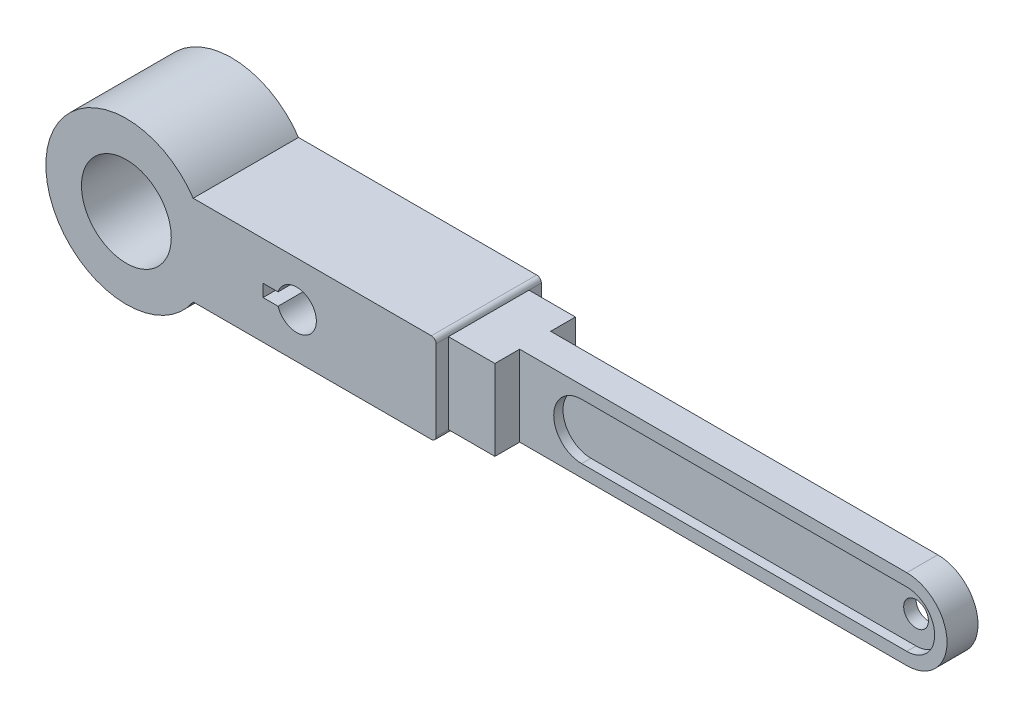
ISO-10303-21;
HEADER;
FILE_DESCRIPTION(('STEP AP214'),'2;1');
FILE_NAME('part.step','',(''),(''),'','','');
FILE_SCHEMA(('AUTOMOTIVE_DESIGN { 1 0 10303 214 1 1 1 1 }'));
ENDSEC;
DATA;
#1=APPLICATION_CONTEXT('core data for automotive mechanical design processes');
#2=APPLICATION_PROTOCOL_DEFINITION('international standard','automotive_design',2000,#1);
#3=PRODUCT_CONTEXT('',#1,'mechanical');
#4=PRODUCT('Part','Part','',(#3));
#5=PRODUCT_RELATED_PRODUCT_CATEGORY('part','',(#4));
#6=PRODUCT_DEFINITION_FORMATION('','',#4);
#7=PRODUCT_DEFINITION_CONTEXT('part definition',#1,'design');
#8=PRODUCT_DEFINITION('design','',#6,#7);
#9=PRODUCT_DEFINITION_SHAPE('','',#8);
#10=(LENGTH_UNIT() NAMED_UNIT(*) SI_UNIT(.MILLI.,.METRE.));
#11=(NAMED_UNIT(*) PLANE_ANGLE_UNIT() SI_UNIT($,.RADIAN.));
#12=(NAMED_UNIT(*) SI_UNIT($,.STERADIAN.) SOLID_ANGLE_UNIT());
#13=UNCERTAINTY_MEASURE_WITH_UNIT(LENGTH_MEASURE(1.E-05),#10,'distance_accuracy_value','');
#14=(GEOMETRIC_REPRESENTATION_CONTEXT(3) GLOBAL_UNCERTAINTY_ASSIGNED_CONTEXT((#13)) GLOBAL_UNIT_ASSIGNED_CONTEXT((#10,
#11,#12)) REPRESENTATION_CONTEXT('',''));
#15=CARTESIAN_POINT('',(0.,0.,0.));
#16=DIRECTION('',(0.,0.,1.));
#17=DIRECTION('',(1.,0.,0.));
#18=AXIS2_PLACEMENT_3D('',#15,#16,#17);
#19=CARTESIAN_POINT('',(18.6199037557532,0.,5.));
#20=DIRECTION('',(0.,0.,-1.));
#21=DIRECTION('',(-1.,0.,0.));
#22=AXIS2_PLACEMENT_3D('',#19,#20,#21);
#23=CYLINDRICAL_SURFACE('',#22,9.);
#24=DIRECTION('',(0.,0.,-1.));
#25=VECTOR('',#24,1.);
#26=CARTESIAN_POINT('',(18.6199037557532,8.99999999999999,5.));
#27=LINE('',#26,#25);
#28=CARTESIAN_POINT('',(18.6199037557532,8.99999999999999,-2.));
#29=VERTEX_POINT('',#28);
#30=CARTESIAN_POINT('',(18.6199037557532,8.99999999999999,-5.));
#31=VERTEX_POINT('',#30);
#32=EDGE_CURVE('E239',#29,#31,#27,.T.);
#33=ORIENTED_EDGE('',*,*,#32,.F.);
#34=CARTESIAN_POINT('',(18.6199037557532,0.,-2.));
#35=DIRECTION('',(0.,0.,1.));
#36=DIRECTION('',(1.,0.,0.));
#37=AXIS2_PLACEMENT_3D('',#34,#35,#36);
#38=CIRCLE('',#37,9.);
#39=CARTESIAN_POINT('',(18.6199037557532,-9.00000000000001,-2.));
#40=VERTEX_POINT('',#39);
#41=EDGE_CURVE('E497',#29,#40,#38,.T.);
#42=ORIENTED_EDGE('',*,*,#41,.T.);
#43=DIRECTION('',(0.,0.,-1.));
#44=VECTOR('',#43,1.);
#45=CARTESIAN_POINT('',(18.6199037557532,-9.00000000000001,5.));
#46=LINE('',#45,#44);
#47=CARTESIAN_POINT('',(18.6199037557532,-9.00000000000001,-5.));
#48=VERTEX_POINT('',#47);
#49=EDGE_CURVE('E458',#40,#48,#46,.T.);
#50=ORIENTED_EDGE('',*,*,#49,.T.);
#51=CARTESIAN_POINT('',(18.6199037557532,0.,-5.));
#52=DIRECTION('',(0.,0.,1.));
#53=DIRECTION('',(1.,0.,0.));
#54=AXIS2_PLACEMENT_3D('',#51,#52,#53);
#55=CIRCLE('',#54,9.);
#56=EDGE_CURVE('E475',#31,#48,#55,.T.);
#57=ORIENTED_EDGE('',*,*,#56,.F.);
#58=EDGE_LOOP('',(#33,#42,#50,#57));
#59=FACE_BOUND('',#58,.T.);
#60=ADVANCED_FACE('F38',(#59),#23,.F.);
#61=CARTESIAN_POINT('',(0.,8.99999999999999,5.));
#62=DIRECTION('',(0.,-1.,0.));
#63=DIRECTION('',(1.,0.,0.));
#64=AXIS2_PLACEMENT_3D('',#61,#62,#63);
#65=PLANE('',#64);
#66=DIRECTION('',(0.,0.,-1.));
#67=VECTOR('',#66,1.);
#68=CARTESIAN_POINT('',(123.619903755753,9.,5.));
#69=LINE('',#68,#67);
#70=CARTESIAN_POINT('',(123.619903755753,9.,-2.));
#71=VERTEX_POINT('',#70);
#72=CARTESIAN_POINT('',(123.619903755753,9.,-5.));
#73=VERTEX_POINT('',#72);
#74=EDGE_CURVE('E461',#71,#73,#69,.T.);
#75=ORIENTED_EDGE('',*,*,#74,.F.);
#76=DIRECTION('',(-1.,0.,0.));
#77=VECTOR('',#76,1.);
#78=CARTESIAN_POINT('',(0.,8.99999999999999,-2.));
#79=LINE('',#78,#77);
#80=EDGE_CURVE('E55',#71,#29,#79,.T.);
#81=ORIENTED_EDGE('',*,*,#80,.T.);
#82=ORIENTED_EDGE('',*,*,#32,.T.);
#83=DIRECTION('',(-1.,0.,0.));
#84=VECTOR('',#83,1.);
#85=CARTESIAN_POINT('',(0.,8.99999999999999,-5.));
#86=LINE('',#85,#84);
#87=EDGE_CURVE('E478',#73,#31,#86,.T.);
#88=ORIENTED_EDGE('',*,*,#87,.F.);
#89=EDGE_LOOP('',(#75,#81,#82,#88));
#90=FACE_BOUND('',#89,.T.);
#91=ADVANCED_FACE('F523',(#90),#65,.T.);
#92=CARTESIAN_POINT('',(123.619903755753,0.,5.));
#93=DIRECTION('',(0.,0.,-1.));
#94=DIRECTION('',(-1.,0.,0.));
#95=AXIS2_PLACEMENT_3D('',#92,#93,#94);
#96=CYLINDRICAL_SURFACE('',#95,9.);
#97=DIRECTION('',(0.,0.,-1.));
#98=VECTOR('',#97,1.);
#99=CARTESIAN_POINT('',(123.619903755753,-9.,5.));
#100=LINE('',#99,#98);
#101=CARTESIAN_POINT('',(123.619903755753,-9.,-2.));
#102=VERTEX_POINT('',#101);
#103=CARTESIAN_POINT('',(123.619903755753,-9.,-5.));
#104=VERTEX_POINT('',#103);
#105=EDGE_CURVE('E457',#102,#104,#100,.T.);
#106=ORIENTED_EDGE('',*,*,#105,.F.);
#107=CARTESIAN_POINT('',(123.619903755753,0.,-2.));
#108=DIRECTION('',(0.,0.,1.));
#109=DIRECTION('',(1.,0.,0.));
#110=AXIS2_PLACEMENT_3D('',#107,#108,#109);
#111=CIRCLE('',#110,9.);
#112=EDGE_CURVE('E63',#102,#71,#111,.T.);
#113=ORIENTED_EDGE('',*,*,#112,.T.);
#114=ORIENTED_EDGE('',*,*,#74,.T.);
#115=CARTESIAN_POINT('',(123.619903755753,0.,-5.));
#116=DIRECTION('',(0.,0.,1.));
#117=DIRECTION('',(1.,0.,0.));
#118=AXIS2_PLACEMENT_3D('',#115,#116,#117);
#119=CIRCLE('',#118,9.);
#120=EDGE_CURVE('E448',#104,#73,#119,.T.);
#121=ORIENTED_EDGE('',*,*,#120,.F.);
#122=EDGE_LOOP('',(#106,#113,#114,#121));
#123=FACE_BOUND('',#122,.T.);
#124=ADVANCED_FACE('F476',(#123),#96,.F.);
#125=CARTESIAN_POINT('',(0.,-9.00000000000001,5.));
#126=DIRECTION('',(0.,-1.,0.));
#127=DIRECTION('',(1.,0.,0.));
#128=AXIS2_PLACEMENT_3D('',#125,#126,#127);
#129=PLANE('',#128);
#130=DIRECTION('',(-1.,0.,0.));
#131=VECTOR('',#130,1.);
#132=CARTESIAN_POINT('',(0.,-9.00000000000001,-2.));
#133=LINE('',#132,#131);
#134=EDGE_CURVE('E469',#102,#40,#133,.T.);
#135=ORIENTED_EDGE('',*,*,#134,.F.);
#136=ORIENTED_EDGE('',*,*,#105,.T.);
#137=DIRECTION('',(-1.,0.,0.));
#138=VECTOR('',#137,1.);
#139=CARTESIAN_POINT('',(0.,-9.00000000000001,-5.));
#140=LINE('',#139,#138);
#141=EDGE_CURVE('E443',#104,#48,#140,.T.);
#142=ORIENTED_EDGE('',*,*,#141,.T.);
#143=ORIENTED_EDGE('',*,*,#49,.F.);
#144=EDGE_LOOP('',(#135,#136,#142,#143));
#145=FACE_BOUND('',#144,.T.);
#146=ADVANCED_FACE('F466',(#145),#129,.F.);
#147=CARTESIAN_POINT('',(-1.37743143338943,0.,13.));
#148=DIRECTION('',(1.,0.,0.));
#149=DIRECTION('',(0.,0.,-1.));
#150=AXIS2_PLACEMENT_3D('',#147,#148,#149);
#151=PLANE('',#150);
#152=DIRECTION('',(0.,0.,-1.));
#153=VECTOR('',#152,1.);
#154=CARTESIAN_POINT('',(-1.37743143338943,13.000001379028,13.));
#155=LINE('',#154,#153);
#156=CARTESIAN_POINT('',(-1.37743143338943,13.000001379028,-4.99999999999999));
#157=VERTEX_POINT('',#156);
#158=CARTESIAN_POINT('',(-1.37743143338943,13.000001379028,-13.));
#159=VERTEX_POINT('',#158);
#160=EDGE_CURVE('E279',#157,#159,#155,.T.);
#161=ORIENTED_EDGE('',*,*,#160,.F.);
#162=DIRECTION('',(0.,-1.,0.));
#163=VECTOR('',#162,1.);
#164=CARTESIAN_POINT('',(-1.37743143338943,0.,-5.));
#165=LINE('',#164,#163);
#166=CARTESIAN_POINT('',(-1.37743143338943,-13.,-4.99999999999999));
#167=VERTEX_POINT('',#166);
#168=EDGE_CURVE('E428',#157,#167,#165,.T.);
#169=ORIENTED_EDGE('',*,*,#168,.T.);
#170=DIRECTION('',(0.,0.,-1.));
#171=VECTOR('',#170,1.);
#172=CARTESIAN_POINT('',(-1.37743143338943,-13.,13.));
#173=LINE('',#172,#171);
#174=CARTESIAN_POINT('',(-1.37743143338943,-13.,-13.));
#175=VERTEX_POINT('',#174);
#176=EDGE_CURVE('E259',#167,#175,#173,.T.);
#177=ORIENTED_EDGE('',*,*,#176,.T.);
#178=DIRECTION('',(0.,-1.,0.));
#179=VECTOR('',#178,1.);
#180=CARTESIAN_POINT('',(-1.37743143338943,0.,-13.));
#181=LINE('',#180,#179);
#182=EDGE_CURVE('E260',#159,#175,#181,.T.);
#183=ORIENTED_EDGE('',*,*,#182,.F.);
#184=EDGE_LOOP('',(#161,#169,#177,#183));
#185=FACE_BOUND('',#184,.T.);
#186=ADVANCED_FACE('F426',(#185),#151,.T.);
#187=CARTESIAN_POINT('',(-16.3774314333894,0.,17.));
#188=DIRECTION('',(1.,0.,0.));
#189=DIRECTION('',(0.,0.,-1.));
#190=AXIS2_PLACEMENT_3D('',#187,#188,#189);
#191=PLANE('',#190);
#192=DIRECTION('',(0.,0.,-1.));
#193=VECTOR('',#192,1.);
#194=CARTESIAN_POINT('',(-16.3774314333894,13.,17.));
#195=LINE('',#194,#193);
#196=CARTESIAN_POINT('',(-16.3774314333894,13.,-13.));
#197=VERTEX_POINT('',#196);
#198=CARTESIAN_POINT('',(-16.3774314333894,13.,-17.));
#199=VERTEX_POINT('',#198);
#200=EDGE_CURVE('E359',#197,#199,#195,.T.);
#201=ORIENTED_EDGE('',*,*,#200,.F.);
#202=DIRECTION('',(0.,-1.,0.));
#203=VECTOR('',#202,1.);
#204=CARTESIAN_POINT('',(-16.3774314333894,0.,-13.));
#205=LINE('',#204,#203);
#206=CARTESIAN_POINT('',(-16.3774314333894,-13.,-13.));
#207=VERTEX_POINT('',#206);
#208=EDGE_CURVE('E267',#197,#207,#205,.T.);
#209=ORIENTED_EDGE('',*,*,#208,.T.);
#210=DIRECTION('',(0.,0.,-1.));
#211=VECTOR('',#210,1.);
#212=CARTESIAN_POINT('',(-16.3774314333894,-13.,17.));
#213=LINE('',#212,#211);
#214=CARTESIAN_POINT('',(-16.3774314333894,-13.,-17.));
#215=VERTEX_POINT('',#214);
#216=EDGE_CURVE('E362',#207,#215,#213,.T.);
#217=ORIENTED_EDGE('',*,*,#216,.T.);
#218=DIRECTION('',(0.,-1.,0.));
#219=VECTOR('',#218,1.);
#220=CARTESIAN_POINT('',(-16.3774314333894,0.,-17.));
#221=LINE('',#220,#219);
#222=EDGE_CURVE('E318',#199,#215,#221,.T.);
#223=ORIENTED_EDGE('',*,*,#222,.F.);
#224=EDGE_LOOP('',(#201,#209,#217,#223));
#225=FACE_BOUND('',#224,.T.);
#226=ADVANCED_FACE('F377',(#225),#191,.T.);
#227=CARTESIAN_POINT('',(-61.3774314333894,0.,17.));
#228=DIRECTION('',(0.,0.,-1.));
#229=DIRECTION('',(-1.,0.,0.));
#230=AXIS2_PLACEMENT_3D('',#227,#228,#229);
#231=CYLINDRICAL_SURFACE('',#230,6.35);
#232=CARTESIAN_POINT('',(-61.3774314333894,0.,-17.));
#233=DIRECTION('',(0.,0.,1.));
#234=DIRECTION('',(1.,0.,0.));
#235=AXIS2_PLACEMENT_3D('',#232,#233,#234);
#236=CIRCLE('',#235,6.35);
#237=CARTESIAN_POINT('',(-67.404246512683,-2.,-17.));
#238=VERTEX_POINT('',#237);
#239=CARTESIAN_POINT('',(-67.404246512683,2.,-17.));
#240=VERTEX_POINT('',#239);
#241=EDGE_CURVE('E333',#238,#240,#236,.T.);
#242=ORIENTED_EDGE('',*,*,#241,.F.);
#243=DIRECTION('',(0.,0.,-1.));
#244=VECTOR('',#243,1.);
#245=CARTESIAN_POINT('',(-67.404246512683,-2.,17.));
#246=LINE('',#245,#244);
#247=CARTESIAN_POINT('',(-67.404246512683,-2.,17.));
#248=VERTEX_POINT('',#247);
#249=EDGE_CURVE('E11',#248,#238,#246,.T.);
#250=ORIENTED_EDGE('',*,*,#249,.F.);
#251=CARTESIAN_POINT('',(-61.3774314333894,0.,17.));
#252=DIRECTION('',(0.,0.,1.));
#253=DIRECTION('',(1.,0.,0.));
#254=AXIS2_PLACEMENT_3D('',#251,#252,#253);
#255=CIRCLE('',#254,6.35);
#256=CARTESIAN_POINT('',(-67.404246512683,2.,17.));
#257=VERTEX_POINT('',#256);
#258=EDGE_CURVE('E301',#248,#257,#255,.T.);
#259=ORIENTED_EDGE('',*,*,#258,.T.);
#260=DIRECTION('',(0.,0.,-1.));
#261=VECTOR('',#260,1.);
#262=CARTESIAN_POINT('',(-67.404246512683,2.,17.));
#263=LINE('',#262,#261);
#264=EDGE_CURVE('E347',#257,#240,#263,.T.);
#265=ORIENTED_EDGE('',*,*,#264,.T.);
#266=EDGE_LOOP('',(#242,#250,#259,#265));
#267=FACE_BOUND('',#266,.T.);
#268=ADVANCED_FACE('F566',(#267),#231,.F.);
#269=CARTESIAN_POINT('',(0.,-1.99999999999999,17.));
#270=DIRECTION('',(0.,-1.,0.));
#271=DIRECTION('',(1.,0.,0.));
#272=AXIS2_PLACEMENT_3D('',#269,#270,#271);
#273=PLANE('',#272);
#274=DIRECTION('',(-1.,0.,0.));
#275=VECTOR('',#274,1.);
#276=CARTESIAN_POINT('',(0.,-1.99999999999999,-17.));
#277=LINE('',#276,#275);
#278=CARTESIAN_POINT('',(-72.2433545143328,-2.,-17.));
#279=VERTEX_POINT('',#278);
#280=EDGE_CURVE('E336',#238,#279,#277,.T.);
#281=ORIENTED_EDGE('',*,*,#280,.T.);
#282=DIRECTION('',(0.,0.,-1.));
#283=VECTOR('',#282,1.);
#284=CARTESIAN_POINT('',(-72.2433545143328,-2.,17.));
#285=LINE('',#284,#283);
#286=CARTESIAN_POINT('',(-72.2433545143328,-2.,17.));
#287=VERTEX_POINT('',#286);
#288=EDGE_CURVE('E47',#287,#279,#285,.T.);
#289=ORIENTED_EDGE('',*,*,#288,.F.);
#290=DIRECTION('',(-1.,0.,0.));
#291=VECTOR('',#290,1.);
#292=CARTESIAN_POINT('',(0.,-1.99999999999999,17.));
#293=LINE('',#292,#291);
#294=EDGE_CURVE('E304',#248,#287,#293,.T.);
#295=ORIENTED_EDGE('',*,*,#294,.F.);
#296=ORIENTED_EDGE('',*,*,#249,.T.);
#297=EDGE_LOOP('',(#281,#289,#295,#296));
#298=FACE_BOUND('',#297,.T.);
#299=ADVANCED_FACE('F590',(#298),#273,.F.);
#300=CARTESIAN_POINT('',(-72.2433545143328,0.,17.));
#301=DIRECTION('',(-1.,0.,0.));
#302=DIRECTION('',(0.,0.,1.));
#303=AXIS2_PLACEMENT_3D('',#300,#301,#302);
#304=PLANE('',#303);
#305=DIRECTION('',(0.,1.,0.));
#306=VECTOR('',#305,1.);
#307=CARTESIAN_POINT('',(-72.2433545143328,0.,-17.));
#308=LINE('',#307,#306);
#309=CARTESIAN_POINT('',(-72.2433545143328,2.,-17.));
#310=VERTEX_POINT('',#309);
#311=EDGE_CURVE('E339',#279,#310,#308,.T.);
#312=ORIENTED_EDGE('',*,*,#311,.T.);
#313=DIRECTION('',(0.,0.,-1.));
#314=VECTOR('',#313,1.);
#315=CARTESIAN_POINT('',(-72.2433545143328,2.,17.));
#316=LINE('',#315,#314);
#317=CARTESIAN_POINT('',(-72.2433545143328,2.,17.));
#318=VERTEX_POINT('',#317);
#319=EDGE_CURVE('E349',#318,#310,#316,.T.);
#320=ORIENTED_EDGE('',*,*,#319,.F.);
#321=DIRECTION('',(0.,1.,0.));
#322=VECTOR('',#321,1.);
#323=CARTESIAN_POINT('',(-72.2433545143328,0.,17.));
#324=LINE('',#323,#322);
#325=EDGE_CURVE('E307',#287,#318,#324,.T.);
#326=ORIENTED_EDGE('',*,*,#325,.F.);
#327=ORIENTED_EDGE('',*,*,#288,.T.);
#328=EDGE_LOOP('',(#312,#320,#326,#327));
#329=FACE_BOUND('',#328,.T.);
#330=ADVANCED_FACE('F587',(#329),#304,.F.);
#331=CARTESIAN_POINT('',(-17.8774314333894,-13.,17.));
#332=DIRECTION('',(0.,0.,-1.));
#333=DIRECTION('',(-1.,0.,0.));
#334=AXIS2_PLACEMENT_3D('',#331,#332,#333);
#335=CYLINDRICAL_SURFACE('',#334,1.5);
#336=CARTESIAN_POINT('',(-17.8774314333894,-13.,-17.));
#337=DIRECTION('',(0.,0.,1.));
#338=DIRECTION('',(1.,0.,0.));
#339=AXIS2_PLACEMENT_3D('',#336,#337,#338);
#340=CIRCLE('',#339,1.5);
#341=CARTESIAN_POINT('',(-17.8774314333894,-14.5,-17.));
#342=VERTEX_POINT('',#341);
#343=EDGE_CURVE('E283',#215,#342,#340,.F.);
#344=ORIENTED_EDGE('',*,*,#343,.F.);
#345=ORIENTED_EDGE('',*,*,#216,.F.);
#346=DIRECTION('',(0.,0.,-1.));
#347=VECTOR('',#346,1.);
#348=CARTESIAN_POINT('',(-16.3774314333894,-13.,13.));
#349=LINE('',#348,#347);
#350=CARTESIAN_POINT('',(-16.3774314333894,-13.,13.));
#351=VERTEX_POINT('',#350);
#352=EDGE_CURVE('E274',#351,#207,#349,.T.);
#353=ORIENTED_EDGE('',*,*,#352,.F.);
#354=CARTESIAN_POINT('',(-16.3774314333894,-13.,17.));
#355=VERTEX_POINT('',#354);
#356=EDGE_CURVE('E42',#355,#351,#213,.T.);
#357=ORIENTED_EDGE('',*,*,#356,.F.);
#358=CARTESIAN_POINT('',(-17.8774314333894,-13.,17.));
#359=DIRECTION('',(0.,0.,1.));
#360=DIRECTION('',(1.,0.,0.));
#361=AXIS2_PLACEMENT_3D('',#358,#359,#360);
#362=CIRCLE('',#361,1.5);
#363=CARTESIAN_POINT('',(-17.8774314333894,-14.5,17.));
#364=VERTEX_POINT('',#363);
#365=EDGE_CURVE('E284',#355,#364,#362,.F.);
#366=ORIENTED_EDGE('',*,*,#365,.T.);
#367=DIRECTION('',(0.,0.,-1.));
#368=VECTOR('',#367,1.);
#369=CARTESIAN_POINT('',(-17.8774314333894,-14.5,17.));
#370=LINE('',#369,#368);
#371=EDGE_CURVE('E315',#364,#342,#370,.T.);
#372=ORIENTED_EDGE('',*,*,#371,.T.);
#373=EDGE_LOOP('',(#344,#345,#353,#357,#366,#372));
#374=FACE_BOUND('',#373,.T.);
#375=ADVANCED_FACE('F40',(#374),#335,.T.);
#376=DIRECTION('',(0.,-1.,0.));
#377=VECTOR('',#376,1.);
#378=CARTESIAN_POINT('',(-16.3774314333894,0.,13.));
#379=LINE('',#378,#377);
#380=CARTESIAN_POINT('',(-16.3774314333894,13.,13.));
#381=VERTEX_POINT('',#380);
#382=EDGE_CURVE('E254',#381,#351,#379,.T.);
#383=ORIENTED_EDGE('',*,*,#382,.F.);
#384=CARTESIAN_POINT('',(-16.3774314333894,13.,17.));
#385=VERTEX_POINT('',#384);
#386=EDGE_CURVE('E360',#385,#381,#195,.T.);
#387=ORIENTED_EDGE('',*,*,#386,.F.);
#388=DIRECTION('',(0.,-1.,0.));
#389=VECTOR('',#388,1.);
#390=CARTESIAN_POINT('',(-16.3774314333894,0.,17.));
#391=LINE('',#390,#389);
#392=EDGE_CURVE('E287',#385,#355,#391,.T.);
#393=ORIENTED_EDGE('',*,*,#392,.T.);
#394=ORIENTED_EDGE('',*,*,#356,.T.);
#395=EDGE_LOOP('',(#383,#387,#393,#394));
#396=FACE_BOUND('',#395,.T.);
#397=ADVANCED_FACE('F401',(#396),#191,.T.);
#398=CARTESIAN_POINT('',(-17.8774314333894,13.,17.));
#399=DIRECTION('',(0.,0.,-1.));
#400=DIRECTION('',(-1.,0.,0.));
#401=AXIS2_PLACEMENT_3D('',#398,#399,#400);
#402=CYLINDRICAL_SURFACE('',#401,1.5);
#403=CARTESIAN_POINT('',(-17.8774314333894,13.,-17.));
#404=DIRECTION('',(0.,0.,1.));
#405=DIRECTION('',(1.,0.,0.));
#406=AXIS2_PLACEMENT_3D('',#403,#404,#405);
#407=CIRCLE('',#406,1.5);
#408=CARTESIAN_POINT('',(-17.8774314333894,14.5,-17.));
#409=VERTEX_POINT('',#408);
#410=EDGE_CURVE('E321',#199,#409,#407,.T.);
#411=ORIENTED_EDGE('',*,*,#410,.T.);
#412=DIRECTION('',(0.,0.,-1.));
#413=VECTOR('',#412,1.);
#414=CARTESIAN_POINT('',(-17.8774314333894,14.5,17.));
#415=LINE('',#414,#413);
#416=CARTESIAN_POINT('',(-17.8774314333894,14.5,17.));
#417=VERTEX_POINT('',#416);
#418=EDGE_CURVE('E358',#417,#409,#415,.T.);
#419=ORIENTED_EDGE('',*,*,#418,.F.);
#420=CARTESIAN_POINT('',(-17.8774314333894,13.,17.));
#421=DIRECTION('',(0.,0.,1.));
#422=DIRECTION('',(1.,0.,0.));
#423=AXIS2_PLACEMENT_3D('',#420,#421,#422);
#424=CIRCLE('',#423,1.5);
#425=EDGE_CURVE('E291',#385,#417,#424,.T.);
#426=ORIENTED_EDGE('',*,*,#425,.F.);
#427=ORIENTED_EDGE('',*,*,#386,.T.);
#428=DIRECTION('',(0.,0.,-1.));
#429=VECTOR('',#428,1.);
#430=CARTESIAN_POINT('',(-16.3774314333894,13.,13.));
#431=LINE('',#430,#429);
#432=EDGE_CURVE('E276',#381,#197,#431,.T.);
#433=ORIENTED_EDGE('',*,*,#432,.T.);
#434=ORIENTED_EDGE('',*,*,#200,.T.);
#435=EDGE_LOOP('',(#411,#419,#426,#427,#433,#434));
#436=FACE_BOUND('',#435,.T.);
#437=ADVANCED_FACE('F367',(#436),#402,.T.);
#438=CARTESIAN_POINT('',(0.,14.5,17.));
#439=DIRECTION('',(0.,1.,0.));
#440=DIRECTION('',(0.,0.,1.));
#441=AXIS2_PLACEMENT_3D('',#438,#439,#440);
#442=PLANE('',#441);
#443=DIRECTION('',(1.,0.,0.));
#444=VECTOR('',#443,1.);
#445=CARTESIAN_POINT('',(0.,14.5,-17.));
#446=LINE('',#445,#444);
#447=CARTESIAN_POINT('',(-94.7961895784822,14.5,-17.));
#448=VERTEX_POINT('',#447);
#449=EDGE_CURVE('E324',#448,#409,#446,.T.);
#450=ORIENTED_EDGE('',*,*,#449,.F.);
#451=DIRECTION('',(0.,0.,-1.));
#452=VECTOR('',#451,1.);
#453=CARTESIAN_POINT('',(-94.7961895784822,14.5,17.));
#454=LINE('',#453,#452);
#455=CARTESIAN_POINT('',(-94.7961895784822,14.5,17.));
#456=VERTEX_POINT('',#455);
#457=EDGE_CURVE('E356',#456,#448,#454,.T.);
#458=ORIENTED_EDGE('',*,*,#457,.F.);
#459=DIRECTION('',(1.,0.,0.));
#460=VECTOR('',#459,1.);
#461=CARTESIAN_POINT('',(0.,14.5,17.));
#462=LINE('',#461,#460);
#463=EDGE_CURVE('E293',#456,#417,#462,.T.);
#464=ORIENTED_EDGE('',*,*,#463,.T.);
#465=ORIENTED_EDGE('',*,*,#418,.T.);
#466=EDGE_LOOP('',(#450,#458,#464,#465));
#467=FACE_BOUND('',#466,.T.);
#468=ADVANCED_FACE('F391',(#467),#442,.T.);
#469=CARTESIAN_POINT('',(-116.377431433389,0.,17.));
#470=DIRECTION('',(0.,0.,-1.));
#471=DIRECTION('',(-1.,0.,0.));
#472=AXIS2_PLACEMENT_3D('',#469,#470,#471);
#473=CYLINDRICAL_SURFACE('',#472,26.);
#474=CARTESIAN_POINT('',(-116.377431433389,0.,-17.));
#475=DIRECTION('',(0.,0.,1.));
#476=DIRECTION('',(1.,0.,0.));
#477=AXIS2_PLACEMENT_3D('',#474,#475,#476);
#478=CIRCLE('',#477,26.);
#479=CARTESIAN_POINT('',(-94.7961895784822,-14.5,-17.));
#480=VERTEX_POINT('',#479);
#481=EDGE_CURVE('E327',#448,#480,#478,.T.);
#482=ORIENTED_EDGE('',*,*,#481,.T.);
#483=DIRECTION('',(0.,0.,-1.));
#484=VECTOR('',#483,1.);
#485=CARTESIAN_POINT('',(-94.7961895784822,-14.5,17.));
#486=LINE('',#485,#484);
#487=CARTESIAN_POINT('',(-94.7961895784822,-14.5,17.));
#488=VERTEX_POINT('',#487);
#489=EDGE_CURVE('E354',#488,#480,#486,.T.);
#490=ORIENTED_EDGE('',*,*,#489,.F.);
#491=CARTESIAN_POINT('',(-116.377431433389,0.,17.));
#492=DIRECTION('',(0.,0.,1.));
#493=DIRECTION('',(1.,0.,0.));
#494=AXIS2_PLACEMENT_3D('',#491,#492,#493);
#495=CIRCLE('',#494,26.);
#496=EDGE_CURVE('E296',#456,#488,#495,.T.);
#497=ORIENTED_EDGE('',*,*,#496,.F.);
#498=ORIENTED_EDGE('',*,*,#457,.T.);
#499=EDGE_LOOP('',(#482,#490,#497,#498));
#500=FACE_BOUND('',#499,.T.);
#501=ADVANCED_FACE('F389',(#500),#473,.T.);
#502=CARTESIAN_POINT('',(0.,2.00000000000001,17.));
#503=DIRECTION('',(0.,-1.,0.));
#504=DIRECTION('',(1.,0.,0.));
#505=AXIS2_PLACEMENT_3D('',#502,#503,#504);
#506=PLANE('',#505);
#507=DIRECTION('',(-1.,0.,0.));
#508=VECTOR('',#507,1.);
#509=CARTESIAN_POINT('',(0.,2.00000000000001,-17.));
#510=LINE('',#509,#508);
#511=EDGE_CURVE('E342',#240,#310,#510,.T.);
#512=ORIENTED_EDGE('',*,*,#511,.F.);
#513=ORIENTED_EDGE('',*,*,#264,.F.);
#514=DIRECTION('',(-1.,0.,0.));
#515=VECTOR('',#514,1.);
#516=CARTESIAN_POINT('',(0.,2.00000000000001,17.));
#517=LINE('',#516,#515);
#518=EDGE_CURVE('E309',#257,#318,#517,.T.);
#519=ORIENTED_EDGE('',*,*,#518,.T.);
#520=ORIENTED_EDGE('',*,*,#319,.T.);
#521=EDGE_LOOP('',(#512,#513,#519,#520));
#522=FACE_BOUND('',#521,.T.);
#523=ADVANCED_FACE('F583',(#522),#506,.T.);
#524=CARTESIAN_POINT('',(0.,-14.4999999999997,17.));
#525=DIRECTION('',(0.,-1.,0.));
#526=DIRECTION('',(1.,0.,0.));
#527=AXIS2_PLACEMENT_3D('',#524,#525,#526);
#528=PLANE('',#527);
#529=DIRECTION('',(-1.,0.,0.));
#530=VECTOR('',#529,1.);
#531=CARTESIAN_POINT('',(0.,-14.4999999999997,-17.));
#532=LINE('',#531,#530);
#533=EDGE_CURVE('E330',#342,#480,#532,.T.);
#534=ORIENTED_EDGE('',*,*,#533,.F.);
#535=ORIENTED_EDGE('',*,*,#371,.F.);
#536=DIRECTION('',(-1.,0.,0.));
#537=VECTOR('',#536,1.);
#538=CARTESIAN_POINT('',(0.,-14.4999999999997,17.));
#539=LINE('',#538,#537);
#540=EDGE_CURVE('E298',#364,#488,#539,.T.);
#541=ORIENTED_EDGE('',*,*,#540,.T.);
#542=ORIENTED_EDGE('',*,*,#489,.T.);
#543=EDGE_LOOP('',(#534,#535,#541,#542));
#544=FACE_BOUND('',#543,.T.);
#545=ADVANCED_FACE('F384',(#544),#528,.T.);
#546=CARTESIAN_POINT('',(-116.377431433389,0.,17.));
#547=DIRECTION('',(0.,0.,-1.));
#548=DIRECTION('',(-1.,0.,0.));
#549=AXIS2_PLACEMENT_3D('',#546,#547,#548);
#550=CYLINDRICAL_SURFACE('',#549,14.5);
#551=CARTESIAN_POINT('',(-116.377431433389,0.,17.));
#552=DIRECTION('',(0.,0.,1.));
#553=DIRECTION('',(1.,0.,0.));
#554=AXIS2_PLACEMENT_3D('',#551,#552,#553);
#555=CIRCLE('',#554,14.5);
#556=CARTESIAN_POINT('',(-101.877431433389,0.,17.));
#557=VERTEX_POINT('',#556);
#558=EDGE_CURVE('E312',#557,#557,#555,.T.);
#559=ORIENTED_EDGE('',*,*,#558,.T.);
#560=EDGE_LOOP('',(#559));
#561=FACE_BOUND('',#560,.T.);
#562=CARTESIAN_POINT('',(-116.377431433389,0.,-17.));
#563=DIRECTION('',(0.,0.,1.));
#564=DIRECTION('',(1.,0.,0.));
#565=AXIS2_PLACEMENT_3D('',#562,#563,#564);
#566=CIRCLE('',#565,14.5);
#567=CARTESIAN_POINT('',(-101.877431433389,0.,-17.));
#568=VERTEX_POINT('',#567);
#569=EDGE_CURVE('E288',#568,#568,#566,.T.);
#570=ORIENTED_EDGE('',*,*,#569,.F.);
#571=EDGE_LOOP('',(#570));
#572=FACE_BOUND('',#571,.T.);
#573=ADVANCED_FACE('F578',(#561,#572),#550,.F.);
#574=CARTESIAN_POINT('',(0.,0.,17.));
#575=DIRECTION('',(0.,0.,1.));
#576=DIRECTION('',(1.,0.,0.));
#577=AXIS2_PLACEMENT_3D('',#574,#575,#576);
#578=PLANE('',#577);
#579=ORIENTED_EDGE('',*,*,#365,.F.);
#580=ORIENTED_EDGE('',*,*,#392,.F.);
#581=ORIENTED_EDGE('',*,*,#425,.T.);
#582=ORIENTED_EDGE('',*,*,#463,.F.);
#583=ORIENTED_EDGE('',*,*,#496,.T.);
#584=ORIENTED_EDGE('',*,*,#540,.F.);
#585=EDGE_LOOP('',(#579,#580,#581,#582,#583,#584));
#586=FACE_BOUND('',#585,.T.);
#587=ORIENTED_EDGE('',*,*,#258,.F.);
#588=ORIENTED_EDGE('',*,*,#294,.T.);
#589=ORIENTED_EDGE('',*,*,#325,.T.);
#590=ORIENTED_EDGE('',*,*,#518,.F.);
#591=EDGE_LOOP('',(#587,#588,#589,#590));
#592=FACE_BOUND('',#591,.T.);
#593=ORIENTED_EDGE('',*,*,#558,.F.);
#594=EDGE_LOOP('',(#593));
#595=FACE_BOUND('',#594,.T.);
#596=ADVANCED_FACE('F396',(#586,#592,#595),#578,.T.);
#597=CARTESIAN_POINT('',(0.,0.,-17.));
#598=DIRECTION('',(0.,0.,1.));
#599=DIRECTION('',(1.,0.,0.));
#600=AXIS2_PLACEMENT_3D('',#597,#598,#599);
#601=PLANE('',#600);
#602=ORIENTED_EDGE('',*,*,#343,.T.);
#603=ORIENTED_EDGE('',*,*,#533,.T.);
#604=ORIENTED_EDGE('',*,*,#481,.F.);
#605=ORIENTED_EDGE('',*,*,#449,.T.);
#606=ORIENTED_EDGE('',*,*,#410,.F.);
#607=ORIENTED_EDGE('',*,*,#222,.T.);
#608=EDGE_LOOP('',(#602,#603,#604,#605,#606,#607));
#609=FACE_BOUND('',#608,.T.);
#610=ORIENTED_EDGE('',*,*,#241,.T.);
#611=ORIENTED_EDGE('',*,*,#511,.T.);
#612=ORIENTED_EDGE('',*,*,#311,.F.);
#613=ORIENTED_EDGE('',*,*,#280,.F.);
#614=EDGE_LOOP('',(#610,#611,#612,#613));
#615=FACE_BOUND('',#614,.T.);
#616=ORIENTED_EDGE('',*,*,#569,.T.);
#617=EDGE_LOOP('',(#616));
#618=FACE_BOUND('',#617,.T.);
#619=ADVANCED_FACE('F373',(#609,#615,#618),#601,.F.);
#620=DIRECTION('',(0.,-1.,0.));
#621=VECTOR('',#620,1.);
#622=CARTESIAN_POINT('',(-1.37743143338943,0.,5.));
#623=LINE('',#622,#621);
#624=CARTESIAN_POINT('',(-1.37743143338943,13.000001379028,5.));
#625=VERTEX_POINT('',#624);
#626=CARTESIAN_POINT('',(-1.37743143338943,-13.,5.));
#627=VERTEX_POINT('',#626);
#628=EDGE_CURVE('E415',#625,#627,#623,.T.);
#629=ORIENTED_EDGE('',*,*,#628,.F.);
#630=CARTESIAN_POINT('',(-1.37743143338943,13.000001379028,13.));
#631=VERTEX_POINT('',#630);
#632=EDGE_CURVE('E280',#631,#625,#155,.T.);
#633=ORIENTED_EDGE('',*,*,#632,.F.);
#634=DIRECTION('',(0.,-1.,0.));
#635=VECTOR('',#634,1.);
#636=CARTESIAN_POINT('',(-1.37743143338943,0.,13.));
#637=LINE('',#636,#635);
#638=CARTESIAN_POINT('',(-1.37743143338943,-13.,13.));
#639=VERTEX_POINT('',#638);
#640=EDGE_CURVE('E248',#631,#639,#637,.T.);
#641=ORIENTED_EDGE('',*,*,#640,.T.);
#642=EDGE_CURVE('E272',#639,#627,#173,.T.);
#643=ORIENTED_EDGE('',*,*,#642,.T.);
#644=EDGE_LOOP('',(#629,#633,#641,#643));
#645=FACE_BOUND('',#644,.T.);
#646=ADVANCED_FACE('F414',(#645),#151,.T.);
#647=CARTESIAN_POINT('',(0.,13.000001379028,13.));
#648=DIRECTION('',(0.,-1.,0.));
#649=DIRECTION('',(1.,0.,0.));
#650=AXIS2_PLACEMENT_3D('',#647,#648,#649);
#651=PLANE('',#650);
#652=DIRECTION('',(-1.,0.,0.));
#653=VECTOR('',#652,1.);
#654=CARTESIAN_POINT('',(0.,13.000001379028,-13.));
#655=LINE('',#654,#653);
#656=EDGE_CURVE('E263',#159,#197,#655,.T.);
#657=ORIENTED_EDGE('',*,*,#656,.T.);
#658=ORIENTED_EDGE('',*,*,#432,.F.);
#659=DIRECTION('',(-1.,0.,0.));
#660=VECTOR('',#659,1.);
#661=CARTESIAN_POINT('',(0.,13.000001379028,13.));
#662=LINE('',#661,#660);
#663=EDGE_CURVE('E251',#631,#381,#662,.T.);
#664=ORIENTED_EDGE('',*,*,#663,.F.);
#665=ORIENTED_EDGE('',*,*,#632,.T.);
#666=DIRECTION('',(1.,0.,0.));
#667=VECTOR('',#666,1.);
#668=CARTESIAN_POINT('',(0.,13.000001379028,5.));
#669=LINE('',#668,#667);
#670=CARTESIAN_POINT('',(123.619903755753,13.0000013790279,5.));
#671=VERTEX_POINT('',#670);
#672=EDGE_CURVE('E483',#625,#671,#669,.T.);
#673=ORIENTED_EDGE('',*,*,#672,.T.);
#674=DIRECTION('',(0.,0.,-1.));
#675=VECTOR('',#674,1.);
#676=CARTESIAN_POINT('',(123.619903755753,13.0000013790279,5.));
#677=LINE('',#676,#675);
#678=CARTESIAN_POINT('',(123.619903755753,13.0000013790279,-5.));
#679=VERTEX_POINT('',#678);
#680=EDGE_CURVE('E242',#671,#679,#677,.T.);
#681=ORIENTED_EDGE('',*,*,#680,.T.);
#682=DIRECTION('',(1.,0.,0.));
#683=VECTOR('',#682,1.);
#684=CARTESIAN_POINT('',(0.,13.000001379028,-5.));
#685=LINE('',#684,#683);
#686=EDGE_CURVE('E445',#157,#679,#685,.T.);
#687=ORIENTED_EDGE('',*,*,#686,.F.);
#688=ORIENTED_EDGE('',*,*,#160,.T.);
#689=EDGE_LOOP('',(#657,#658,#664,#665,#673,#681,#687,#688));
#690=FACE_BOUND('',#689,.T.);
#691=ADVANCED_FACE('F419',(#690),#651,.F.);
#692=CARTESIAN_POINT('',(1.19515753223868E-06,-12.9999998733655,13.));
#693=DIRECTION('',(9.19351956831419E-08,-0.999999999999996,0.));
#694=DIRECTION('',(0.999999999999996,9.19351956831419E-08,0.));
#695=AXIS2_PLACEMENT_3D('',#692,#693,#694);
#696=PLANE('',#695);
#697=DIRECTION('',(-0.999999999999996,-9.19351956831419E-08,0.));
#698=VECTOR('',#697,1.);
#699=CARTESIAN_POINT('',(1.19515753223868E-06,-12.9999998733655,-13.));
#700=LINE('',#699,#698);
#701=EDGE_CURVE('E252',#175,#207,#700,.T.);
#702=ORIENTED_EDGE('',*,*,#701,.F.);
#703=ORIENTED_EDGE('',*,*,#176,.F.);
#704=DIRECTION('',(0.,0.,-1.));
#705=VECTOR('',#704,1.);
#706=CARTESIAN_POINT('',(-1.37743143338943,-13.,5.));
#707=LINE('',#706,#705);
#708=EDGE_CURVE('E238',#627,#167,#707,.T.);
#709=ORIENTED_EDGE('',*,*,#708,.F.);
#710=ORIENTED_EDGE('',*,*,#642,.F.);
#711=DIRECTION('',(-0.999999999999996,-9.19351956831419E-08,0.));
#712=VECTOR('',#711,1.);
#713=CARTESIAN_POINT('',(1.19515753223868E-06,-12.9999998733655,13.));
#714=LINE('',#713,#712);
#715=EDGE_CURVE('E256',#639,#351,#714,.T.);
#716=ORIENTED_EDGE('',*,*,#715,.T.);
#717=ORIENTED_EDGE('',*,*,#352,.T.);
#718=EDGE_LOOP('',(#702,#703,#709,#710,#716,#717));
#719=FACE_BOUND('',#718,.T.);
#720=ADVANCED_FACE('F409',(#719),#696,.T.);
#721=CARTESIAN_POINT('',(0.,0.,13.));
#722=DIRECTION('',(0.,0.,1.));
#723=DIRECTION('',(1.,0.,0.));
#724=AXIS2_PLACEMENT_3D('',#721,#722,#723);
#725=PLANE('',#724);
#726=ORIENTED_EDGE('',*,*,#640,.F.);
#727=ORIENTED_EDGE('',*,*,#663,.T.);
#728=ORIENTED_EDGE('',*,*,#382,.T.);
#729=ORIENTED_EDGE('',*,*,#715,.F.);
#730=EDGE_LOOP('',(#726,#727,#728,#729));
#731=FACE_BOUND('',#730,.T.);
#732=ADVANCED_FACE('F405',(#731),#725,.T.);
#733=CARTESIAN_POINT('',(0.,0.,-13.));
#734=DIRECTION('',(0.,0.,1.));
#735=DIRECTION('',(1.,0.,0.));
#736=AXIS2_PLACEMENT_3D('',#733,#734,#735);
#737=PLANE('',#736);
#738=ORIENTED_EDGE('',*,*,#182,.T.);
#739=ORIENTED_EDGE('',*,*,#701,.T.);
#740=ORIENTED_EDGE('',*,*,#208,.F.);
#741=ORIENTED_EDGE('',*,*,#656,.F.);
#742=EDGE_LOOP('',(#738,#739,#740,#741));
#743=FACE_BOUND('',#742,.T.);
#744=ADVANCED_FACE('F424',(#743),#737,.F.);
#745=CARTESIAN_POINT('',(0.,-13.,5.));
#746=DIRECTION('',(0.,-1.,0.));
#747=DIRECTION('',(1.,0.,0.));
#748=AXIS2_PLACEMENT_3D('',#745,#746,#747);
#749=PLANE('',#748);
#750=DIRECTION('',(-1.,0.,0.));
#751=VECTOR('',#750,1.);
#752=CARTESIAN_POINT('',(0.,-13.,-5.));
#753=LINE('',#752,#751);
#754=CARTESIAN_POINT('',(123.625891637578,-13.,-5.));
#755=VERTEX_POINT('',#754);
#756=EDGE_CURVE('E434',#755,#167,#753,.T.);
#757=ORIENTED_EDGE('',*,*,#756,.F.);
#758=DIRECTION('',(0.,0.,-1.));
#759=VECTOR('',#758,1.);
#760=CARTESIAN_POINT('',(123.625891637578,-13.,5.));
#761=LINE('',#760,#759);
#762=CARTESIAN_POINT('',(123.625891637578,-13.,5.));
#763=VERTEX_POINT('',#762);
#764=EDGE_CURVE('E264',#763,#755,#761,.T.);
#765=ORIENTED_EDGE('',*,*,#764,.F.);
#766=DIRECTION('',(-1.,0.,0.));
#767=VECTOR('',#766,1.);
#768=CARTESIAN_POINT('',(0.,-13.,5.));
#769=LINE('',#768,#767);
#770=EDGE_CURVE('E436',#763,#627,#769,.T.);
#771=ORIENTED_EDGE('',*,*,#770,.T.);
#772=ORIENTED_EDGE('',*,*,#708,.T.);
#773=EDGE_LOOP('',(#757,#765,#771,#772));
#774=FACE_BOUND('',#773,.T.);
#775=ADVANCED_FACE('F433',(#774),#749,.T.);
#776=CARTESIAN_POINT('',(123.619903755753,0.,5.));
#777=DIRECTION('',(0.,0.,-1.));
#778=DIRECTION('',(-1.,0.,0.));
#779=AXIS2_PLACEMENT_3D('',#776,#777,#778);
#780=CYLINDRICAL_SURFACE('',#779,13.0000013790279);
#781=CARTESIAN_POINT('',(123.619903755753,0.,-5.));
#782=DIRECTION('',(0.,0.,1.));
#783=DIRECTION('',(1.,0.,0.));
#784=AXIS2_PLACEMENT_3D('',#781,#782,#783);
#785=CIRCLE('',#784,13.0000013790279);
#786=EDGE_CURVE('E442',#755,#679,#785,.T.);
#787=ORIENTED_EDGE('',*,*,#786,.T.);
#788=ORIENTED_EDGE('',*,*,#680,.F.);
#789=CARTESIAN_POINT('',(123.619903755753,0.,5.));
#790=DIRECTION('',(0.,0.,1.));
#791=DIRECTION('',(1.,0.,0.));
#792=AXIS2_PLACEMENT_3D('',#789,#790,#791);
#793=CIRCLE('',#792,13.0000013790279);
#794=EDGE_CURVE('E485',#763,#671,#793,.T.);
#795=ORIENTED_EDGE('',*,*,#794,.F.);
#796=ORIENTED_EDGE('',*,*,#764,.T.);
#797=EDGE_LOOP('',(#787,#788,#795,#796));
#798=FACE_BOUND('',#797,.T.);
#799=ADVANCED_FACE('F532',(#798),#780,.T.);
#800=CARTESIAN_POINT('',(18.6199037557532,0.,2.));
#801=DIRECTION('',(0.,0.,1.));
#802=DIRECTION('',(1.,0.,0.));
#803=AXIS2_PLACEMENT_3D('',#800,#801,#802);
#804=CIRCLE('',#803,9.);
#805=CARTESIAN_POINT('',(18.6199037557532,8.99999999999999,2.));
#806=VERTEX_POINT('',#805);
#807=CARTESIAN_POINT('',(18.6199037557532,-9.00000000000001,2.));
#808=VERTEX_POINT('',#807);
#809=EDGE_CURVE('E215',#806,#808,#804,.T.);
#810=ORIENTED_EDGE('',*,*,#809,.F.);
#811=CARTESIAN_POINT('',(18.6199037557532,8.99999999999999,5.));
#812=VERTEX_POINT('',#811);
#813=EDGE_CURVE('E228',#812,#806,#27,.T.);
#814=ORIENTED_EDGE('',*,*,#813,.F.);
#815=CARTESIAN_POINT('',(18.6199037557532,0.,5.));
#816=DIRECTION('',(0.,0.,1.));
#817=DIRECTION('',(1.,0.,0.));
#818=AXIS2_PLACEMENT_3D('',#815,#816,#817);
#819=CIRCLE('',#818,9.);
#820=CARTESIAN_POINT('',(18.6199037557532,-9.00000000000001,5.));
#821=VERTEX_POINT('',#820);
#822=EDGE_CURVE('E453',#812,#821,#819,.T.);
#823=ORIENTED_EDGE('',*,*,#822,.T.);
#824=EDGE_CURVE('E231',#821,#808,#46,.T.);
#825=ORIENTED_EDGE('',*,*,#824,.T.);
#826=EDGE_LOOP('',(#810,#814,#823,#825));
#827=FACE_BOUND('',#826,.T.);
#828=ADVANCED_FACE('F226',(#827),#23,.F.);
#829=DIRECTION('',(-1.,0.,0.));
#830=VECTOR('',#829,1.);
#831=CARTESIAN_POINT('',(0.,8.99999999999999,2.));
#832=LINE('',#831,#830);
#833=CARTESIAN_POINT('',(123.619903755753,9.,2.));
#834=VERTEX_POINT('',#833);
#835=EDGE_CURVE('E212',#834,#806,#832,.T.);
#836=ORIENTED_EDGE('',*,*,#835,.F.);
#837=CARTESIAN_POINT('',(123.619903755753,9.,5.));
#838=VERTEX_POINT('',#837);
#839=EDGE_CURVE('E244',#838,#834,#69,.T.);
#840=ORIENTED_EDGE('',*,*,#839,.F.);
#841=DIRECTION('',(-1.,0.,0.));
#842=VECTOR('',#841,1.);
#843=CARTESIAN_POINT('',(0.,8.99999999999999,5.));
#844=LINE('',#843,#842);
#845=EDGE_CURVE('E237',#838,#812,#844,.T.);
#846=ORIENTED_EDGE('',*,*,#845,.T.);
#847=ORIENTED_EDGE('',*,*,#813,.T.);
#848=EDGE_LOOP('',(#836,#840,#846,#847));
#849=FACE_BOUND('',#848,.T.);
#850=ADVANCED_FACE('F235',(#849),#65,.T.);
#851=CARTESIAN_POINT('',(123.619903755753,0.,2.));
#852=DIRECTION('',(0.,0.,1.));
#853=DIRECTION('',(1.,0.,0.));
#854=AXIS2_PLACEMENT_3D('',#851,#852,#853);
#855=CIRCLE('',#854,9.);
#856=CARTESIAN_POINT('',(123.619903755753,-9.,2.));
#857=VERTEX_POINT('',#856);
#858=EDGE_CURVE('E218',#857,#834,#855,.T.);
#859=ORIENTED_EDGE('',*,*,#858,.F.);
#860=CARTESIAN_POINT('',(123.619903755753,-9.,5.));
#861=VERTEX_POINT('',#860);
#862=EDGE_CURVE('E459',#861,#857,#100,.T.);
#863=ORIENTED_EDGE('',*,*,#862,.F.);
#864=CARTESIAN_POINT('',(123.619903755753,0.,5.));
#865=DIRECTION('',(0.,0.,1.));
#866=DIRECTION('',(1.,0.,0.));
#867=AXIS2_PLACEMENT_3D('',#864,#865,#866);
#868=CIRCLE('',#867,9.);
#869=EDGE_CURVE('E490',#861,#838,#868,.T.);
#870=ORIENTED_EDGE('',*,*,#869,.T.);
#871=ORIENTED_EDGE('',*,*,#839,.T.);
#872=EDGE_LOOP('',(#859,#863,#870,#871));
#873=FACE_BOUND('',#872,.T.);
#874=ADVANCED_FACE('F537',(#873),#96,.F.);
#875=ORIENTED_EDGE('',*,*,#862,.T.);
#876=DIRECTION('',(-1.,0.,0.));
#877=VECTOR('',#876,1.);
#878=CARTESIAN_POINT('',(0.,-9.00000000000001,2.));
#879=LINE('',#878,#877);
#880=EDGE_CURVE('E232',#857,#808,#879,.T.);
#881=ORIENTED_EDGE('',*,*,#880,.T.);
#882=ORIENTED_EDGE('',*,*,#824,.F.);
#883=DIRECTION('',(-1.,0.,0.));
#884=VECTOR('',#883,1.);
#885=CARTESIAN_POINT('',(0.,-9.00000000000001,5.));
#886=LINE('',#885,#884);
#887=EDGE_CURVE('E488',#861,#821,#886,.T.);
#888=ORIENTED_EDGE('',*,*,#887,.F.);
#889=EDGE_LOOP('',(#875,#881,#882,#888));
#890=FACE_BOUND('',#889,.T.);
#891=ADVANCED_FACE('F547',(#890),#129,.F.);
#892=CARTESIAN_POINT('',(0.,0.,5.));
#893=DIRECTION('',(0.,0.,1.));
#894=DIRECTION('',(1.,0.,0.));
#895=AXIS2_PLACEMENT_3D('',#892,#893,#894);
#896=PLANE('',#895);
#897=ORIENTED_EDGE('',*,*,#822,.F.);
#898=ORIENTED_EDGE('',*,*,#845,.F.);
#899=ORIENTED_EDGE('',*,*,#869,.F.);
#900=ORIENTED_EDGE('',*,*,#887,.T.);
#901=EDGE_LOOP('',(#897,#898,#899,#900));
#902=FACE_BOUND('',#901,.T.);
#903=ORIENTED_EDGE('',*,*,#770,.F.);
#904=ORIENTED_EDGE('',*,*,#794,.T.);
#905=ORIENTED_EDGE('',*,*,#672,.F.);
#906=ORIENTED_EDGE('',*,*,#628,.T.);
#907=EDGE_LOOP('',(#903,#904,#905,#906));
#908=FACE_BOUND('',#907,.T.);
#909=ADVANCED_FACE('F550',(#902,#908),#896,.T.);
#910=CARTESIAN_POINT('',(0.,0.,-5.));
#911=DIRECTION('',(0.,0.,1.));
#912=DIRECTION('',(1.,0.,0.));
#913=AXIS2_PLACEMENT_3D('',#910,#911,#912);
#914=PLANE('',#913);
#915=ORIENTED_EDGE('',*,*,#56,.T.);
#916=ORIENTED_EDGE('',*,*,#141,.F.);
#917=ORIENTED_EDGE('',*,*,#120,.T.);
#918=ORIENTED_EDGE('',*,*,#87,.T.);
#919=EDGE_LOOP('',(#915,#916,#917,#918));
#920=FACE_BOUND('',#919,.T.);
#921=ORIENTED_EDGE('',*,*,#756,.T.);
#922=ORIENTED_EDGE('',*,*,#168,.F.);
#923=ORIENTED_EDGE('',*,*,#686,.T.);
#924=ORIENTED_EDGE('',*,*,#786,.F.);
#925=EDGE_LOOP('',(#921,#922,#923,#924));
#926=FACE_BOUND('',#925,.T.);
#927=ADVANCED_FACE('F439',(#920,#926),#914,.F.);
#928=CARTESIAN_POINT('',(123.619903755753,0.,2.));
#929=DIRECTION('',(0.,0.,-1.));
#930=DIRECTION('',(-1.,0.,0.));
#931=AXIS2_PLACEMENT_3D('',#928,#929,#930);
#932=CYLINDRICAL_SURFACE('',#931,3.99999999999999);
#933=CARTESIAN_POINT('',(123.619903755753,0.,2.));
#934=DIRECTION('',(0.,0.,1.));
#935=DIRECTION('',(1.,0.,0.));
#936=AXIS2_PLACEMENT_3D('',#933,#934,#935);
#937=CIRCLE('',#936,3.99999999999999);
#938=CARTESIAN_POINT('',(127.619903755753,0.,2.));
#939=VERTEX_POINT('',#938);
#940=EDGE_CURVE('E222',#939,#939,#937,.T.);
#941=ORIENTED_EDGE('',*,*,#940,.T.);
#942=EDGE_LOOP('',(#941));
#943=FACE_BOUND('',#942,.T.);
#944=CARTESIAN_POINT('',(123.619903755753,0.,-2.));
#945=DIRECTION('',(0.,0.,1.));
#946=DIRECTION('',(1.,0.,0.));
#947=AXIS2_PLACEMENT_3D('',#944,#945,#946);
#948=CIRCLE('',#947,3.99999999999999);
#949=CARTESIAN_POINT('',(127.619903755753,0.,-2.));
#950=VERTEX_POINT('',#949);
#951=EDGE_CURVE('E501',#950,#950,#948,.T.);
#952=ORIENTED_EDGE('',*,*,#951,.F.);
#953=EDGE_LOOP('',(#952));
#954=FACE_BOUND('',#953,.T.);
#955=ADVANCED_FACE('F509',(#943,#954),#932,.F.);
#956=CARTESIAN_POINT('',(0.,0.,2.));
#957=DIRECTION('',(0.,0.,1.));
#958=DIRECTION('',(1.,0.,0.));
#959=AXIS2_PLACEMENT_3D('',#956,#957,#958);
#960=PLANE('',#959);
#961=ORIENTED_EDGE('',*,*,#940,.F.);
#962=EDGE_LOOP('',(#961));
#963=FACE_BOUND('',#962,.T.);
#964=ORIENTED_EDGE('',*,*,#835,.T.);
#965=ORIENTED_EDGE('',*,*,#809,.T.);
#966=ORIENTED_EDGE('',*,*,#880,.F.);
#967=ORIENTED_EDGE('',*,*,#858,.T.);
#968=EDGE_LOOP('',(#964,#965,#966,#967));
#969=FACE_BOUND('',#968,.T.);
#970=ADVANCED_FACE('F214',(#963,#969),#960,.T.);
#971=CARTESIAN_POINT('',(0.,0.,-2.));
#972=DIRECTION('',(0.,0.,1.));
#973=DIRECTION('',(1.,0.,0.));
#974=AXIS2_PLACEMENT_3D('',#971,#972,#973);
#975=PLANE('',#974);
#976=ORIENTED_EDGE('',*,*,#951,.T.);
#977=EDGE_LOOP('',(#976));
#978=FACE_BOUND('',#977,.T.);
#979=ORIENTED_EDGE('',*,*,#80,.F.);
#980=ORIENTED_EDGE('',*,*,#112,.F.);
#981=ORIENTED_EDGE('',*,*,#134,.T.);
#982=ORIENTED_EDGE('',*,*,#41,.F.);
#983=EDGE_LOOP('',(#979,#980,#981,#982));
#984=FACE_BOUND('',#983,.T.);
#985=ADVANCED_FACE('F513',(#978,#984),#975,.F.);
#986=CLOSED_SHELL('',(#60,#91,#124,#146,#186,#226,#268,#299,#330,#375,#397,#437,#468,#501,#523,
#545,#573,#596,#619,#646,#691,#720,#732,#744,#775,#799,#828,#850,#874,#891,#909,#927,#955,#970,#985));
#987=MANIFOLD_SOLID_BREP('B2',#986);
#988=ADVANCED_BREP_SHAPE_REPRESENTATION('',(#18,#987),#14);
#989=SHAPE_DEFINITION_REPRESENTATION(#9,#988);
ENDSEC;
END-ISO-10303-21;
